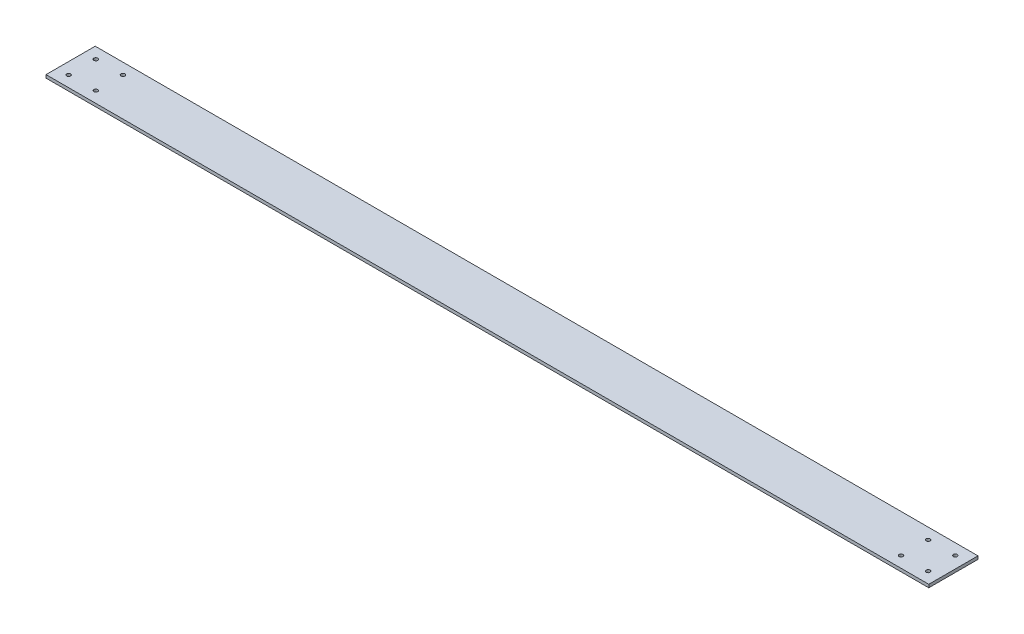
ISO-10303-21;
HEADER;
FILE_DESCRIPTION(('STEP AP214'),'2;1');
FILE_NAME('part.step','',(''),(''),'','','');
FILE_SCHEMA(('AUTOMOTIVE_DESIGN { 1 0 10303 214 1 1 1 1 }'));
ENDSEC;
DATA;
#1=APPLICATION_CONTEXT('core data for automotive mechanical design processes');
#2=APPLICATION_PROTOCOL_DEFINITION('international standard','automotive_design',2000,#1);
#3=PRODUCT_CONTEXT('',#1,'mechanical');
#4=PRODUCT('Part','Part','',(#3));
#5=PRODUCT_RELATED_PRODUCT_CATEGORY('part','',(#4));
#6=PRODUCT_DEFINITION_FORMATION('','',#4);
#7=PRODUCT_DEFINITION_CONTEXT('part definition',#1,'design');
#8=PRODUCT_DEFINITION('design','',#6,#7);
#9=PRODUCT_DEFINITION_SHAPE('','',#8);
#10=(LENGTH_UNIT() NAMED_UNIT(*) SI_UNIT(.MILLI.,.METRE.));
#11=(NAMED_UNIT(*) PLANE_ANGLE_UNIT() SI_UNIT($,.RADIAN.));
#12=(NAMED_UNIT(*) SI_UNIT($,.STERADIAN.) SOLID_ANGLE_UNIT());
#13=UNCERTAINTY_MEASURE_WITH_UNIT(LENGTH_MEASURE(1.E-05),#10,'distance_accuracy_value','');
#14=(GEOMETRIC_REPRESENTATION_CONTEXT(3) GLOBAL_UNCERTAINTY_ASSIGNED_CONTEXT((#13)) GLOBAL_UNIT_ASSIGNED_CONTEXT((#10,
#11,#12)) REPRESENTATION_CONTEXT('',''));
#15=CARTESIAN_POINT('',(0.,0.,0.));
#16=DIRECTION('',(0.,0.,1.));
#17=DIRECTION('',(1.,0.,0.));
#18=AXIS2_PLACEMENT_3D('',#15,#16,#17);
#19=CARTESIAN_POINT('',(0.,3.175,0.));
#20=DIRECTION('',(0.,-1.,0.));
#21=DIRECTION('',(0.,0.,-1.));
#22=AXIS2_PLACEMENT_3D('',#19,#20,#21);
#23=PLANE('',#22);
#24=DIRECTION('',(0.,0.,1.));
#25=VECTOR('',#24,1.);
#26=CARTESIAN_POINT('',(0.,3.175,0.));
#27=LINE('',#26,#25);
#28=CARTESIAN_POINT('',(0.,3.175,-50.8));
#29=VERTEX_POINT('',#28);
#30=CARTESIAN_POINT('',(0.,3.175,0.));
#31=VERTEX_POINT('',#30);
#32=EDGE_CURVE('E84',#29,#31,#27,.T.);
#33=ORIENTED_EDGE('',*,*,#32,.T.);
#34=DIRECTION('',(1.,0.,0.));
#35=VECTOR('',#34,1.);
#36=CARTESIAN_POINT('',(0.,3.175,0.));
#37=LINE('',#36,#35);
#38=CARTESIAN_POINT('',(910.88,3.175,0.));
#39=VERTEX_POINT('',#38);
#40=EDGE_CURVE('E79',#31,#39,#37,.T.);
#41=ORIENTED_EDGE('',*,*,#40,.T.);
#42=DIRECTION('',(0.,0.,-1.));
#43=VECTOR('',#42,1.);
#44=CARTESIAN_POINT('',(910.88,3.175,0.));
#45=LINE('',#44,#43);
#46=CARTESIAN_POINT('',(910.88,3.175,-50.8));
#47=VERTEX_POINT('',#46);
#48=EDGE_CURVE('E82',#39,#47,#45,.T.);
#49=ORIENTED_EDGE('',*,*,#48,.T.);
#50=DIRECTION('',(-1.,0.,0.));
#51=VECTOR('',#50,1.);
#52=CARTESIAN_POINT('',(0.,3.175,-50.8));
#53=LINE('',#52,#51);
#54=EDGE_CURVE('E49',#47,#29,#53,.T.);
#55=ORIENTED_EDGE('',*,*,#54,.T.);
#56=EDGE_LOOP('',(#33,#41,#49,#55));
#57=FACE_BOUND('',#56,.T.);
#58=CARTESIAN_POINT('',(12.,3.175,-39.4));
#59=DIRECTION('',(0.,1.,0.));
#60=DIRECTION('',(0.,0.,1.));
#61=AXIS2_PLACEMENT_3D('',#58,#59,#60);
#62=CIRCLE('',#61,2.);
#63=CARTESIAN_POINT('',(12.,3.175,-37.4));
#64=VERTEX_POINT('',#63);
#65=EDGE_CURVE('E99',#64,#64,#62,.T.);
#66=ORIENTED_EDGE('',*,*,#65,.F.);
#67=EDGE_LOOP('',(#66));
#68=FACE_BOUND('',#67,.T.);
#69=CARTESIAN_POINT('',(12.,3.175,-11.4));
#70=DIRECTION('',(0.,1.,0.));
#71=DIRECTION('',(0.,0.,1.));
#72=AXIS2_PLACEMENT_3D('',#69,#70,#71);
#73=CIRCLE('',#72,2.);
#74=CARTESIAN_POINT('',(12.,3.175,-9.4));
#75=VERTEX_POINT('',#74);
#76=EDGE_CURVE('E114',#75,#75,#73,.T.);
#77=ORIENTED_EDGE('',*,*,#76,.F.);
#78=EDGE_LOOP('',(#77));
#79=FACE_BOUND('',#78,.T.);
#80=CARTESIAN_POINT('',(898.88,3.175,-39.4));
#81=DIRECTION('',(0.,1.,0.));
#82=DIRECTION('',(0.,0.,1.));
#83=AXIS2_PLACEMENT_3D('',#80,#81,#82);
#84=CIRCLE('',#83,2.);
#85=CARTESIAN_POINT('',(898.88,3.175,-37.4));
#86=VERTEX_POINT('',#85);
#87=EDGE_CURVE('E120',#86,#86,#84,.T.);
#88=ORIENTED_EDGE('',*,*,#87,.F.);
#89=EDGE_LOOP('',(#88));
#90=FACE_BOUND('',#89,.T.);
#91=CARTESIAN_POINT('',(898.88,3.175,-11.4));
#92=DIRECTION('',(0.,1.,0.));
#93=DIRECTION('',(0.,0.,1.));
#94=AXIS2_PLACEMENT_3D('',#91,#92,#93);
#95=CIRCLE('',#94,2.);
#96=CARTESIAN_POINT('',(898.88,3.175,-9.4));
#97=VERTEX_POINT('',#96);
#98=EDGE_CURVE('E126',#97,#97,#95,.T.);
#99=ORIENTED_EDGE('',*,*,#98,.F.);
#100=EDGE_LOOP('',(#99));
#101=FACE_BOUND('',#100,.T.);
#102=CARTESIAN_POINT('',(40.,3.175,-39.4));
#103=DIRECTION('',(0.,1.,0.));
#104=DIRECTION('',(0.,0.,1.));
#105=AXIS2_PLACEMENT_3D('',#102,#103,#104);
#106=CIRCLE('',#105,2.);
#107=CARTESIAN_POINT('',(40.,3.175,-37.4));
#108=VERTEX_POINT('',#107);
#109=EDGE_CURVE('E132',#108,#108,#106,.T.);
#110=ORIENTED_EDGE('',*,*,#109,.F.);
#111=EDGE_LOOP('',(#110));
#112=FACE_BOUND('',#111,.T.);
#113=CARTESIAN_POINT('',(40.,3.175,-11.4));
#114=DIRECTION('',(0.,1.,0.));
#115=DIRECTION('',(0.,0.,1.));
#116=AXIS2_PLACEMENT_3D('',#113,#114,#115);
#117=CIRCLE('',#116,2.);
#118=CARTESIAN_POINT('',(40.,3.175,-9.4));
#119=VERTEX_POINT('',#118);
#120=EDGE_CURVE('E138',#119,#119,#117,.T.);
#121=ORIENTED_EDGE('',*,*,#120,.F.);
#122=EDGE_LOOP('',(#121));
#123=FACE_BOUND('',#122,.T.);
#124=CARTESIAN_POINT('',(870.88,3.175,-39.4));
#125=DIRECTION('',(0.,1.,0.));
#126=DIRECTION('',(0.,0.,1.));
#127=AXIS2_PLACEMENT_3D('',#124,#125,#126);
#128=CIRCLE('',#127,2.);
#129=CARTESIAN_POINT('',(870.88,3.175,-37.4));
#130=VERTEX_POINT('',#129);
#131=EDGE_CURVE('E144',#130,#130,#128,.T.);
#132=ORIENTED_EDGE('',*,*,#131,.F.);
#133=EDGE_LOOP('',(#132));
#134=FACE_BOUND('',#133,.T.);
#135=CARTESIAN_POINT('',(870.88,3.175,-11.4));
#136=DIRECTION('',(0.,1.,0.));
#137=DIRECTION('',(0.,0.,1.));
#138=AXIS2_PLACEMENT_3D('',#135,#136,#137);
#139=CIRCLE('',#138,2.);
#140=CARTESIAN_POINT('',(870.88,3.175,-9.4));
#141=VERTEX_POINT('',#140);
#142=EDGE_CURVE('E150',#141,#141,#139,.T.);
#143=ORIENTED_EDGE('',*,*,#142,.F.);
#144=EDGE_LOOP('',(#143));
#145=FACE_BOUND('',#144,.T.);
#146=ADVANCED_FACE('F32',(#57,#68,#79,#90,#101,#112,#123,#134,#145),#23,.F.);
#147=CARTESIAN_POINT('',(0.,0.,0.));
#148=DIRECTION('',(0.,-1.,0.));
#149=DIRECTION('',(0.,0.,-1.));
#150=AXIS2_PLACEMENT_3D('',#147,#148,#149);
#151=PLANE('',#150);
#152=CARTESIAN_POINT('',(870.88,0.,-39.4));
#153=DIRECTION('',(0.,1.,0.));
#154=DIRECTION('',(0.,0.,1.));
#155=AXIS2_PLACEMENT_3D('',#152,#153,#154);
#156=CIRCLE('',#155,2.);
#157=CARTESIAN_POINT('',(870.88,0.,-37.4));
#158=VERTEX_POINT('',#157);
#159=EDGE_CURVE('E147',#158,#158,#156,.T.);
#160=ORIENTED_EDGE('',*,*,#159,.T.);
#161=EDGE_LOOP('',(#160));
#162=FACE_BOUND('',#161,.T.);
#163=CARTESIAN_POINT('',(40.,0.,-39.4));
#164=DIRECTION('',(0.,1.,0.));
#165=DIRECTION('',(0.,0.,1.));
#166=AXIS2_PLACEMENT_3D('',#163,#164,#165);
#167=CIRCLE('',#166,2.);
#168=CARTESIAN_POINT('',(40.,0.,-37.4));
#169=VERTEX_POINT('',#168);
#170=EDGE_CURVE('E135',#169,#169,#167,.T.);
#171=ORIENTED_EDGE('',*,*,#170,.T.);
#172=EDGE_LOOP('',(#171));
#173=FACE_BOUND('',#172,.T.);
#174=CARTESIAN_POINT('',(898.88,0.,-39.4));
#175=DIRECTION('',(0.,1.,0.));
#176=DIRECTION('',(0.,0.,1.));
#177=AXIS2_PLACEMENT_3D('',#174,#175,#176);
#178=CIRCLE('',#177,2.);
#179=CARTESIAN_POINT('',(898.88,0.,-37.4));
#180=VERTEX_POINT('',#179);
#181=EDGE_CURVE('E123',#180,#180,#178,.T.);
#182=ORIENTED_EDGE('',*,*,#181,.T.);
#183=EDGE_LOOP('',(#182));
#184=FACE_BOUND('',#183,.T.);
#185=CARTESIAN_POINT('',(12.,0.,-39.4));
#186=DIRECTION('',(0.,1.,0.));
#187=DIRECTION('',(0.,0.,1.));
#188=AXIS2_PLACEMENT_3D('',#185,#186,#187);
#189=CIRCLE('',#188,2.);
#190=CARTESIAN_POINT('',(12.,0.,-37.4));
#191=VERTEX_POINT('',#190);
#192=EDGE_CURVE('E111',#191,#191,#189,.T.);
#193=ORIENTED_EDGE('',*,*,#192,.T.);
#194=EDGE_LOOP('',(#193));
#195=FACE_BOUND('',#194,.T.);
#196=DIRECTION('',(0.,0.,1.));
#197=VECTOR('',#196,1.);
#198=CARTESIAN_POINT('',(0.,0.,0.));
#199=LINE('',#198,#197);
#200=CARTESIAN_POINT('',(0.,0.,-50.8));
#201=VERTEX_POINT('',#200);
#202=CARTESIAN_POINT('',(0.,0.,0.));
#203=VERTEX_POINT('',#202);
#204=EDGE_CURVE('E96',#201,#203,#199,.T.);
#205=ORIENTED_EDGE('',*,*,#204,.F.);
#206=DIRECTION('',(-1.,0.,0.));
#207=VECTOR('',#206,1.);
#208=CARTESIAN_POINT('',(0.,0.,-50.8));
#209=LINE('',#208,#207);
#210=CARTESIAN_POINT('',(910.88,0.,-50.8));
#211=VERTEX_POINT('',#210);
#212=EDGE_CURVE('E72',#211,#201,#209,.T.);
#213=ORIENTED_EDGE('',*,*,#212,.F.);
#214=DIRECTION('',(0.,0.,-1.));
#215=VECTOR('',#214,1.);
#216=CARTESIAN_POINT('',(910.88,0.,0.));
#217=LINE('',#216,#215);
#218=CARTESIAN_POINT('',(910.88,0.,0.));
#219=VERTEX_POINT('',#218);
#220=EDGE_CURVE('E66',#219,#211,#217,.T.);
#221=ORIENTED_EDGE('',*,*,#220,.F.);
#222=DIRECTION('',(1.,0.,0.));
#223=VECTOR('',#222,1.);
#224=CARTESIAN_POINT('',(0.,0.,0.));
#225=LINE('',#224,#223);
#226=EDGE_CURVE('E88',#203,#219,#225,.T.);
#227=ORIENTED_EDGE('',*,*,#226,.F.);
#228=EDGE_LOOP('',(#205,#213,#221,#227));
#229=FACE_BOUND('',#228,.T.);
#230=CARTESIAN_POINT('',(12.,0.,-11.4));
#231=DIRECTION('',(0.,1.,0.));
#232=DIRECTION('',(0.,0.,1.));
#233=AXIS2_PLACEMENT_3D('',#230,#231,#232);
#234=CIRCLE('',#233,2.);
#235=CARTESIAN_POINT('',(12.,0.,-9.4));
#236=VERTEX_POINT('',#235);
#237=EDGE_CURVE('E117',#236,#236,#234,.T.);
#238=ORIENTED_EDGE('',*,*,#237,.T.);
#239=EDGE_LOOP('',(#238));
#240=FACE_BOUND('',#239,.T.);
#241=CARTESIAN_POINT('',(898.88,0.,-11.4));
#242=DIRECTION('',(0.,1.,0.));
#243=DIRECTION('',(0.,0.,1.));
#244=AXIS2_PLACEMENT_3D('',#241,#242,#243);
#245=CIRCLE('',#244,2.);
#246=CARTESIAN_POINT('',(898.88,0.,-9.4));
#247=VERTEX_POINT('',#246);
#248=EDGE_CURVE('E129',#247,#247,#245,.T.);
#249=ORIENTED_EDGE('',*,*,#248,.T.);
#250=EDGE_LOOP('',(#249));
#251=FACE_BOUND('',#250,.T.);
#252=CARTESIAN_POINT('',(40.,0.,-11.4));
#253=DIRECTION('',(0.,1.,0.));
#254=DIRECTION('',(0.,0.,1.));
#255=AXIS2_PLACEMENT_3D('',#252,#253,#254);
#256=CIRCLE('',#255,2.);
#257=CARTESIAN_POINT('',(40.,0.,-9.4));
#258=VERTEX_POINT('',#257);
#259=EDGE_CURVE('E141',#258,#258,#256,.T.);
#260=ORIENTED_EDGE('',*,*,#259,.T.);
#261=EDGE_LOOP('',(#260));
#262=FACE_BOUND('',#261,.T.);
#263=CARTESIAN_POINT('',(870.88,0.,-11.4));
#264=DIRECTION('',(0.,1.,0.));
#265=DIRECTION('',(0.,0.,1.));
#266=AXIS2_PLACEMENT_3D('',#263,#264,#265);
#267=CIRCLE('',#266,2.);
#268=CARTESIAN_POINT('',(870.88,0.,-9.4));
#269=VERTEX_POINT('',#268);
#270=EDGE_CURVE('E153',#269,#269,#267,.T.);
#271=ORIENTED_EDGE('',*,*,#270,.T.);
#272=EDGE_LOOP('',(#271));
#273=FACE_BOUND('',#272,.T.);
#274=ADVANCED_FACE('F107',(#162,#173,#184,#195,#229,#240,#251,#262,#273),#151,.T.);
#275=CARTESIAN_POINT('',(0.,3.175,0.));
#276=DIRECTION('',(1.,0.,0.));
#277=DIRECTION('',(0.,0.,-1.));
#278=AXIS2_PLACEMENT_3D('',#275,#276,#277);
#279=PLANE('',#278);
#280=ORIENTED_EDGE('',*,*,#204,.T.);
#281=DIRECTION('',(0.,-1.,0.));
#282=VECTOR('',#281,1.);
#283=CARTESIAN_POINT('',(0.,3.175,0.));
#284=LINE('',#283,#282);
#285=EDGE_CURVE('E11',#31,#203,#284,.T.);
#286=ORIENTED_EDGE('',*,*,#285,.F.);
#287=ORIENTED_EDGE('',*,*,#32,.F.);
#288=DIRECTION('',(0.,-1.,0.));
#289=VECTOR('',#288,1.);
#290=CARTESIAN_POINT('',(0.,3.175,-50.8));
#291=LINE('',#290,#289);
#292=EDGE_CURVE('E92',#29,#201,#291,.T.);
#293=ORIENTED_EDGE('',*,*,#292,.T.);
#294=EDGE_LOOP('',(#280,#286,#287,#293));
#295=FACE_BOUND('',#294,.T.);
#296=ADVANCED_FACE('F34',(#295),#279,.F.);
#297=CARTESIAN_POINT('',(0.,3.175,0.));
#298=DIRECTION('',(0.,0.,-1.));
#299=DIRECTION('',(-1.,0.,0.));
#300=AXIS2_PLACEMENT_3D('',#297,#298,#299);
#301=PLANE('',#300);
#302=ORIENTED_EDGE('',*,*,#226,.T.);
#303=DIRECTION('',(0.,-1.,0.));
#304=VECTOR('',#303,1.);
#305=CARTESIAN_POINT('',(910.88,3.175,0.));
#306=LINE('',#305,#304);
#307=EDGE_CURVE('E41',#39,#219,#306,.T.);
#308=ORIENTED_EDGE('',*,*,#307,.F.);
#309=ORIENTED_EDGE('',*,*,#40,.F.);
#310=ORIENTED_EDGE('',*,*,#285,.T.);
#311=EDGE_LOOP('',(#302,#308,#309,#310));
#312=FACE_BOUND('',#311,.T.);
#313=ADVANCED_FACE('F87',(#312),#301,.F.);
#314=CARTESIAN_POINT('',(910.88,3.175,0.));
#315=DIRECTION('',(-1.,0.,0.));
#316=DIRECTION('',(0.,0.,1.));
#317=AXIS2_PLACEMENT_3D('',#314,#315,#316);
#318=PLANE('',#317);
#319=ORIENTED_EDGE('',*,*,#220,.T.);
#320=DIRECTION('',(0.,-1.,0.));
#321=VECTOR('',#320,1.);
#322=CARTESIAN_POINT('',(910.88,3.175,-50.8));
#323=LINE('',#322,#321);
#324=EDGE_CURVE('E89',#47,#211,#323,.T.);
#325=ORIENTED_EDGE('',*,*,#324,.F.);
#326=ORIENTED_EDGE('',*,*,#48,.F.);
#327=ORIENTED_EDGE('',*,*,#307,.T.);
#328=EDGE_LOOP('',(#319,#325,#326,#327));
#329=FACE_BOUND('',#328,.T.);
#330=ADVANCED_FACE('F90',(#329),#318,.F.);
#331=CARTESIAN_POINT('',(0.,3.175,-50.8));
#332=DIRECTION('',(0.,0.,1.));
#333=DIRECTION('',(1.,0.,0.));
#334=AXIS2_PLACEMENT_3D('',#331,#332,#333);
#335=PLANE('',#334);
#336=ORIENTED_EDGE('',*,*,#212,.T.);
#337=ORIENTED_EDGE('',*,*,#292,.F.);
#338=ORIENTED_EDGE('',*,*,#54,.F.);
#339=ORIENTED_EDGE('',*,*,#324,.T.);
#340=EDGE_LOOP('',(#336,#337,#338,#339));
#341=FACE_BOUND('',#340,.T.);
#342=ADVANCED_FACE('F104',(#341),#335,.F.);
#343=CARTESIAN_POINT('',(12.,3.175,-39.4));
#344=DIRECTION('',(0.,-1.,0.));
#345=DIRECTION('',(0.,0.,-1.));
#346=AXIS2_PLACEMENT_3D('',#343,#344,#345);
#347=CYLINDRICAL_SURFACE('',#346,2.);
#348=ORIENTED_EDGE('',*,*,#65,.T.);
#349=EDGE_LOOP('',(#348));
#350=FACE_BOUND('',#349,.T.);
#351=ORIENTED_EDGE('',*,*,#192,.F.);
#352=EDGE_LOOP('',(#351));
#353=FACE_BOUND('',#352,.T.);
#354=ADVANCED_FACE('F170',(#350,#353),#347,.F.);
#355=CARTESIAN_POINT('',(12.,3.175,-11.4));
#356=DIRECTION('',(0.,-1.,0.));
#357=DIRECTION('',(0.,0.,-1.));
#358=AXIS2_PLACEMENT_3D('',#355,#356,#357);
#359=CYLINDRICAL_SURFACE('',#358,2.);
#360=ORIENTED_EDGE('',*,*,#76,.T.);
#361=EDGE_LOOP('',(#360));
#362=FACE_BOUND('',#361,.T.);
#363=ORIENTED_EDGE('',*,*,#237,.F.);
#364=EDGE_LOOP('',(#363));
#365=FACE_BOUND('',#364,.T.);
#366=ADVANCED_FACE('F216',(#362,#365),#359,.F.);
#367=CARTESIAN_POINT('',(898.88,3.175,-39.4));
#368=DIRECTION('',(0.,-1.,0.));
#369=DIRECTION('',(0.,0.,-1.));
#370=AXIS2_PLACEMENT_3D('',#367,#368,#369);
#371=CYLINDRICAL_SURFACE('',#370,2.);
#372=ORIENTED_EDGE('',*,*,#87,.T.);
#373=EDGE_LOOP('',(#372));
#374=FACE_BOUND('',#373,.T.);
#375=ORIENTED_EDGE('',*,*,#181,.F.);
#376=EDGE_LOOP('',(#375));
#377=FACE_BOUND('',#376,.T.);
#378=ADVANCED_FACE('F224',(#374,#377),#371,.F.);
#379=CARTESIAN_POINT('',(898.88,3.175,-11.4));
#380=DIRECTION('',(0.,-1.,0.));
#381=DIRECTION('',(0.,0.,-1.));
#382=AXIS2_PLACEMENT_3D('',#379,#380,#381);
#383=CYLINDRICAL_SURFACE('',#382,2.);
#384=ORIENTED_EDGE('',*,*,#98,.T.);
#385=EDGE_LOOP('',(#384));
#386=FACE_BOUND('',#385,.T.);
#387=ORIENTED_EDGE('',*,*,#248,.F.);
#388=EDGE_LOOP('',(#387));
#389=FACE_BOUND('',#388,.T.);
#390=ADVANCED_FACE('F232',(#386,#389),#383,.F.);
#391=CARTESIAN_POINT('',(40.,3.175,-39.4));
#392=DIRECTION('',(0.,-1.,0.));
#393=DIRECTION('',(0.,0.,-1.));
#394=AXIS2_PLACEMENT_3D('',#391,#392,#393);
#395=CYLINDRICAL_SURFACE('',#394,2.);
#396=ORIENTED_EDGE('',*,*,#109,.T.);
#397=EDGE_LOOP('',(#396));
#398=FACE_BOUND('',#397,.T.);
#399=ORIENTED_EDGE('',*,*,#170,.F.);
#400=EDGE_LOOP('',(#399));
#401=FACE_BOUND('',#400,.T.);
#402=ADVANCED_FACE('F241',(#398,#401),#395,.F.);
#403=CARTESIAN_POINT('',(40.,3.175,-11.4));
#404=DIRECTION('',(0.,-1.,0.));
#405=DIRECTION('',(0.,0.,-1.));
#406=AXIS2_PLACEMENT_3D('',#403,#404,#405);
#407=CYLINDRICAL_SURFACE('',#406,2.);
#408=ORIENTED_EDGE('',*,*,#120,.T.);
#409=EDGE_LOOP('',(#408));
#410=FACE_BOUND('',#409,.T.);
#411=ORIENTED_EDGE('',*,*,#259,.F.);
#412=EDGE_LOOP('',(#411));
#413=FACE_BOUND('',#412,.T.);
#414=ADVANCED_FACE('F250',(#410,#413),#407,.F.);
#415=CARTESIAN_POINT('',(870.88,3.175,-39.4));
#416=DIRECTION('',(0.,-1.,0.));
#417=DIRECTION('',(0.,0.,-1.));
#418=AXIS2_PLACEMENT_3D('',#415,#416,#417);
#419=CYLINDRICAL_SURFACE('',#418,2.);
#420=ORIENTED_EDGE('',*,*,#131,.T.);
#421=EDGE_LOOP('',(#420));
#422=FACE_BOUND('',#421,.T.);
#423=ORIENTED_EDGE('',*,*,#159,.F.);
#424=EDGE_LOOP('',(#423));
#425=FACE_BOUND('',#424,.T.);
#426=ADVANCED_FACE('F259',(#422,#425),#419,.F.);
#427=CARTESIAN_POINT('',(870.88,3.175,-11.4));
#428=DIRECTION('',(0.,-1.,0.));
#429=DIRECTION('',(0.,0.,-1.));
#430=AXIS2_PLACEMENT_3D('',#427,#428,#429);
#431=CYLINDRICAL_SURFACE('',#430,2.);
#432=ORIENTED_EDGE('',*,*,#142,.T.);
#433=EDGE_LOOP('',(#432));
#434=FACE_BOUND('',#433,.T.);
#435=ORIENTED_EDGE('',*,*,#270,.F.);
#436=EDGE_LOOP('',(#435));
#437=FACE_BOUND('',#436,.T.);
#438=ADVANCED_FACE('F159',(#434,#437),#431,.F.);
#439=CLOSED_SHELL('',(#146,#274,#296,#313,#330,#342,#354,#366,#378,#390,#402,#414,#426,#438));
#440=MANIFOLD_SOLID_BREP('B2',#439);
#441=ADVANCED_BREP_SHAPE_REPRESENTATION('',(#18,#440),#14);
#442=SHAPE_DEFINITION_REPRESENTATION(#9,#441);
ENDSEC;
END-ISO-10303-21;
